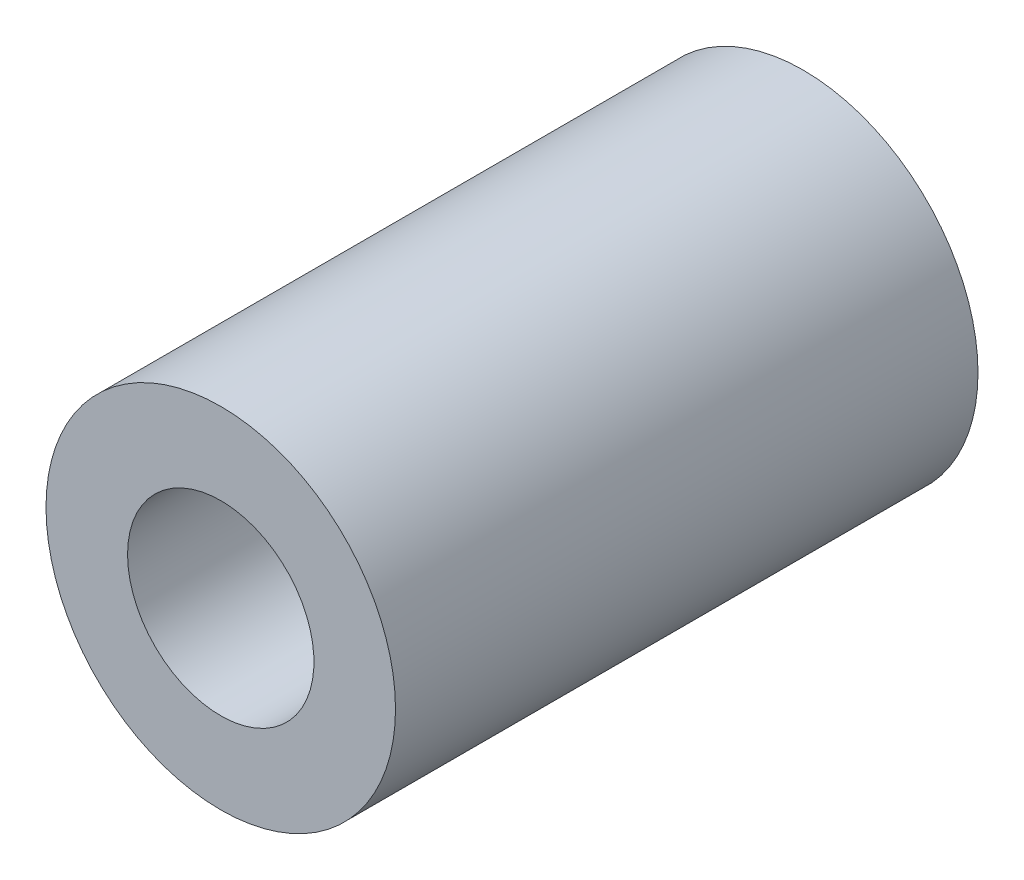
ISO-10303-21;
HEADER;
FILE_DESCRIPTION(('STEP AP214'),'2;1');
FILE_NAME('part.step','',(''),(''),'','','');
FILE_SCHEMA(('AUTOMOTIVE_DESIGN { 1 0 10303 214 1 1 1 1 }'));
ENDSEC;
DATA;
#1=APPLICATION_CONTEXT('core data for automotive mechanical design processes');
#2=APPLICATION_PROTOCOL_DEFINITION('international standard','automotive_design',2000,#1);
#3=PRODUCT_CONTEXT('',#1,'mechanical');
#4=PRODUCT('Part','Part','',(#3));
#5=PRODUCT_RELATED_PRODUCT_CATEGORY('part','',(#4));
#6=PRODUCT_DEFINITION_FORMATION('','',#4);
#7=PRODUCT_DEFINITION_CONTEXT('part definition',#1,'design');
#8=PRODUCT_DEFINITION('design','',#6,#7);
#9=PRODUCT_DEFINITION_SHAPE('','',#8);
#10=(LENGTH_UNIT() NAMED_UNIT(*) SI_UNIT(.MILLI.,.METRE.));
#11=(NAMED_UNIT(*) PLANE_ANGLE_UNIT() SI_UNIT($,.RADIAN.));
#12=(NAMED_UNIT(*) SI_UNIT($,.STERADIAN.) SOLID_ANGLE_UNIT());
#13=UNCERTAINTY_MEASURE_WITH_UNIT(LENGTH_MEASURE(1.E-05),#10,'distance_accuracy_value','');
#14=(GEOMETRIC_REPRESENTATION_CONTEXT(3) GLOBAL_UNCERTAINTY_ASSIGNED_CONTEXT((#13)) GLOBAL_UNIT_ASSIGNED_CONTEXT((#10,
#11,#12)) REPRESENTATION_CONTEXT('',''));
#15=CARTESIAN_POINT('',(0.,0.,0.));
#16=DIRECTION('',(0.,0.,1.));
#17=DIRECTION('',(1.,0.,0.));
#18=AXIS2_PLACEMENT_3D('',#15,#16,#17);
#19=CARTESIAN_POINT('',(0.,0.,5.));
#20=DIRECTION('',(0.,0.,-1.));
#21=DIRECTION('',(-1.,0.,0.));
#22=AXIS2_PLACEMENT_3D('',#19,#20,#21);
#23=CYLINDRICAL_SURFACE('',#22,1.5);
#24=CARTESIAN_POINT('',(0.,0.,5.));
#25=DIRECTION('',(0.,0.,1.));
#26=DIRECTION('',(1.,0.,0.));
#27=AXIS2_PLACEMENT_3D('',#24,#25,#26);
#28=CIRCLE('',#27,1.5);
#29=CARTESIAN_POINT('',(1.5,0.,5.));
#30=VERTEX_POINT('',#29);
#31=EDGE_CURVE('E10',#30,#30,#28,.T.);
#32=ORIENTED_EDGE('',*,*,#31,.F.);
#33=EDGE_LOOP('',(#32));
#34=FACE_BOUND('',#33,.T.);
#35=CARTESIAN_POINT('',(0.,0.,0.));
#36=DIRECTION('',(0.,0.,1.));
#37=DIRECTION('',(1.,0.,0.));
#38=AXIS2_PLACEMENT_3D('',#35,#36,#37);
#39=CIRCLE('',#38,1.5);
#40=CARTESIAN_POINT('',(1.5,0.,0.));
#41=VERTEX_POINT('',#40);
#42=EDGE_CURVE('E41',#41,#41,#39,.T.);
#43=ORIENTED_EDGE('',*,*,#42,.T.);
#44=EDGE_LOOP('',(#43));
#45=FACE_BOUND('',#44,.T.);
#46=ADVANCED_FACE('F38',(#34,#45),#23,.T.);
#47=CARTESIAN_POINT('',(0.,0.,5.));
#48=DIRECTION('',(0.,0.,1.));
#49=DIRECTION('',(1.,0.,0.));
#50=AXIS2_PLACEMENT_3D('',#47,#48,#49);
#51=PLANE('',#50);
#52=CARTESIAN_POINT('',(0.,0.,5.));
#53=DIRECTION('',(0.,0.,-1.));
#54=DIRECTION('',(-1.,0.,0.));
#55=AXIS2_PLACEMENT_3D('',#52,#53,#54);
#56=CIRCLE('',#55,0.799999999999999);
#57=CARTESIAN_POINT('',(-0.799999999999999,0.,5.));
#58=VERTEX_POINT('',#57);
#59=EDGE_CURVE('E48',#58,#58,#56,.T.);
#60=ORIENTED_EDGE('',*,*,#59,.T.);
#61=EDGE_LOOP('',(#60));
#62=FACE_BOUND('',#61,.T.);
#63=ORIENTED_EDGE('',*,*,#31,.T.);
#64=EDGE_LOOP('',(#63));
#65=FACE_BOUND('',#64,.T.);
#66=ADVANCED_FACE('F61',(#62,#65),#51,.T.);
#67=CARTESIAN_POINT('',(0.,0.,0.));
#68=DIRECTION('',(0.,0.,1.));
#69=DIRECTION('',(1.,0.,0.));
#70=AXIS2_PLACEMENT_3D('',#67,#68,#69);
#71=PLANE('',#70);
#72=CARTESIAN_POINT('',(0.,0.,0.));
#73=DIRECTION('',(0.,0.,-1.));
#74=DIRECTION('',(-1.,0.,0.));
#75=AXIS2_PLACEMENT_3D('',#72,#73,#74);
#76=CIRCLE('',#75,0.799999999999988);
#77=CARTESIAN_POINT('',(-0.799999999999988,0.,0.));
#78=VERTEX_POINT('',#77);
#79=EDGE_CURVE('E52',#78,#78,#76,.T.);
#80=ORIENTED_EDGE('',*,*,#79,.F.);
#81=EDGE_LOOP('',(#80));
#82=FACE_BOUND('',#81,.T.);
#83=ORIENTED_EDGE('',*,*,#42,.F.);
#84=EDGE_LOOP('',(#83));
#85=FACE_BOUND('',#84,.T.);
#86=ADVANCED_FACE('F58',(#82,#85),#71,.F.);
#87=CARTESIAN_POINT('',(0.,0.,0.));
#88=DIRECTION('',(0.,0.,-1.));
#89=DIRECTION('',(-1.,0.,0.));
#90=AXIS2_PLACEMENT_3D('',#87,#88,#89);
#91=CYLINDRICAL_SURFACE('',#90,0.799999999999993);
#92=ORIENTED_EDGE('',*,*,#59,.F.);
#93=EDGE_LOOP('',(#92));
#94=FACE_BOUND('',#93,.T.);
#95=ORIENTED_EDGE('',*,*,#79,.T.);
#96=EDGE_LOOP('',(#95));
#97=FACE_BOUND('',#96,.T.);
#98=ADVANCED_FACE('F56',(#94,#97),#91,.F.);
#99=CLOSED_SHELL('',(#46,#66,#86,#98));
#100=MANIFOLD_SOLID_BREP('B2',#99);
#101=ADVANCED_BREP_SHAPE_REPRESENTATION('',(#18,#100),#14);
#102=SHAPE_DEFINITION_REPRESENTATION(#9,#101);
ENDSEC;
END-ISO-10303-21;
